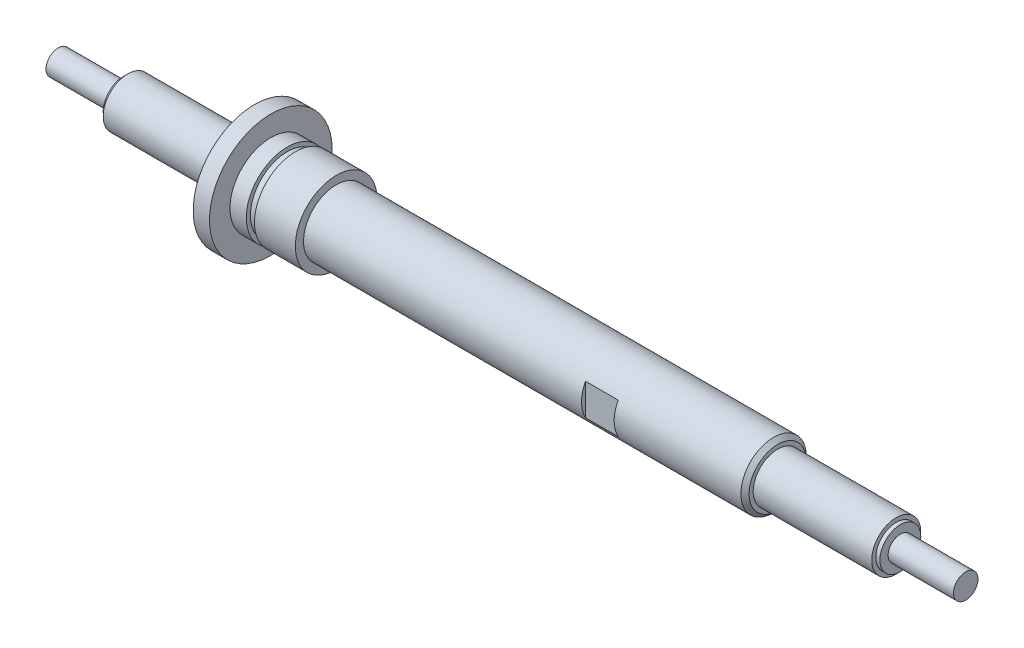
ISO-10303-21;
HEADER;
FILE_DESCRIPTION(('STEP AP214'),'2;1');
FILE_NAME('part.step','',(''),(''),'','','');
FILE_SCHEMA(('AUTOMOTIVE_DESIGN { 1 0 10303 214 1 1 1 1 }'));
ENDSEC;
DATA;
#1=APPLICATION_CONTEXT('core data for automotive mechanical design processes');
#2=APPLICATION_PROTOCOL_DEFINITION('international standard','automotive_design',2000,#1);
#3=PRODUCT_CONTEXT('',#1,'mechanical');
#4=PRODUCT('Part','Part','',(#3));
#5=PRODUCT_RELATED_PRODUCT_CATEGORY('part','',(#4));
#6=PRODUCT_DEFINITION_FORMATION('','',#4);
#7=PRODUCT_DEFINITION_CONTEXT('part definition',#1,'design');
#8=PRODUCT_DEFINITION('design','',#6,#7);
#9=PRODUCT_DEFINITION_SHAPE('','',#8);
#10=(LENGTH_UNIT() NAMED_UNIT(*) SI_UNIT(.MILLI.,.METRE.));
#11=(NAMED_UNIT(*) PLANE_ANGLE_UNIT() SI_UNIT($,.RADIAN.));
#12=(NAMED_UNIT(*) SI_UNIT($,.STERADIAN.) SOLID_ANGLE_UNIT());
#13=UNCERTAINTY_MEASURE_WITH_UNIT(LENGTH_MEASURE(1.E-05),#10,'distance_accuracy_value','');
#14=(GEOMETRIC_REPRESENTATION_CONTEXT(3) GLOBAL_UNCERTAINTY_ASSIGNED_CONTEXT((#13)) GLOBAL_UNIT_ASSIGNED_CONTEXT((#10,
#11,#12)) REPRESENTATION_CONTEXT('',''));
#15=CARTESIAN_POINT('',(0.,0.,0.));
#16=DIRECTION('',(0.,0.,1.));
#17=DIRECTION('',(1.,0.,0.));
#18=AXIS2_PLACEMENT_3D('',#15,#16,#17);
#19=CARTESIAN_POINT('',(-6.,0.,0.));
#20=DIRECTION('',(1.,0.,0.));
#21=DIRECTION('',(0.,0.,-1.));
#22=AXIS2_PLACEMENT_3D('',#19,#20,#21);
#23=CYLINDRICAL_SURFACE('',#22,3.);
#24=CARTESIAN_POINT('',(0.,0.,0.));
#25=DIRECTION('',(1.,0.,0.));
#26=DIRECTION('',(0.,0.,-1.));
#27=AXIS2_PLACEMENT_3D('',#24,#25,#26);
#28=CIRCLE('',#27,3.);
#29=CARTESIAN_POINT('',(0.,0.,-3.));
#30=VERTEX_POINT('',#29);
#31=EDGE_CURVE('E184',#30,#30,#28,.F.);
#32=ORIENTED_EDGE('',*,*,#31,.T.);
#33=EDGE_LOOP('',(#32));
#34=FACE_BOUND('',#33,.T.);
#35=CARTESIAN_POINT('',(-14.5,0.,0.));
#36=DIRECTION('',(1.,0.,0.));
#37=DIRECTION('',(0.,0.,-1.));
#38=AXIS2_PLACEMENT_3D('',#35,#36,#37);
#39=CIRCLE('',#38,3.);
#40=CARTESIAN_POINT('',(-14.5,0.,-3.));
#41=VERTEX_POINT('',#40);
#42=EDGE_CURVE('E243',#41,#41,#39,.T.);
#43=ORIENTED_EDGE('',*,*,#42,.T.);
#44=EDGE_LOOP('',(#43));
#45=FACE_BOUND('',#44,.T.);
#46=ADVANCED_FACE('F103',(#34,#45),#23,.T.);
#47=CARTESIAN_POINT('',(71.,0.,0.));
#48=DIRECTION('',(-1.,0.,0.));
#49=DIRECTION('',(0.,0.,1.));
#50=AXIS2_PLACEMENT_3D('',#47,#48,#49);
#51=CYLINDRICAL_SURFACE('',#50,3.);
#52=CARTESIAN_POINT('',(65.,0.,0.));
#53=DIRECTION('',(1.,0.,0.));
#54=DIRECTION('',(0.,0.,-1.));
#55=AXIS2_PLACEMENT_3D('',#52,#53,#54);
#56=CIRCLE('',#55,3.);
#57=CARTESIAN_POINT('',(65.,0.,-3.));
#58=VERTEX_POINT('',#57);
#59=EDGE_CURVE('E205',#58,#58,#56,.T.);
#60=ORIENTED_EDGE('',*,*,#59,.T.);
#61=EDGE_LOOP('',(#60));
#62=FACE_BOUND('',#61,.T.);
#63=CARTESIAN_POINT('',(79.5,0.,0.));
#64=DIRECTION('',(1.,0.,0.));
#65=DIRECTION('',(0.,0.,-1.));
#66=AXIS2_PLACEMENT_3D('',#63,#64,#65);
#67=CIRCLE('',#66,3.);
#68=CARTESIAN_POINT('',(79.5,0.,-3.));
#69=VERTEX_POINT('',#68);
#70=EDGE_CURVE('E228',#69,#69,#67,.T.);
#71=ORIENTED_EDGE('',*,*,#70,.F.);
#72=EDGE_LOOP('',(#71));
#73=FACE_BOUND('',#72,.T.);
#74=ADVANCED_FACE('F283',(#62,#73),#51,.T.);
#75=CARTESIAN_POINT('',(11.,0.,0.));
#76=DIRECTION('',(-1.,0.,0.));
#77=DIRECTION('',(0.,0.,1.));
#78=AXIS2_PLACEMENT_3D('',#75,#76,#77);
#79=CYLINDRICAL_SURFACE('',#78,5.);
#80=CARTESIAN_POINT('',(3.,0.,0.));
#81=DIRECTION('',(1.,0.,0.));
#82=DIRECTION('',(0.,0.,-1.));
#83=AXIS2_PLACEMENT_3D('',#80,#81,#82);
#84=CIRCLE('',#83,5.);
#85=CARTESIAN_POINT('',(3.,0.,-5.));
#86=VERTEX_POINT('',#85);
#87=EDGE_CURVE('E197',#86,#86,#84,.T.);
#88=ORIENTED_EDGE('',*,*,#87,.T.);
#89=EDGE_LOOP('',(#88));
#90=FACE_BOUND('',#89,.T.);
#91=CARTESIAN_POINT('',(5.,0.,0.));
#92=DIRECTION('',(1.,0.,0.));
#93=DIRECTION('',(0.,0.,-1.));
#94=AXIS2_PLACEMENT_3D('',#91,#92,#93);
#95=CIRCLE('',#94,5.);
#96=CARTESIAN_POINT('',(5.,0.,-5.));
#97=VERTEX_POINT('',#96);
#98=EDGE_CURVE('E209',#97,#97,#95,.T.);
#99=ORIENTED_EDGE('',*,*,#98,.F.);
#100=EDGE_LOOP('',(#99));
#101=FACE_BOUND('',#100,.T.);
#102=ADVANCED_FACE('F288',(#90,#101),#79,.T.);
#103=CARTESIAN_POINT('',(3.,0.,0.));
#104=DIRECTION('',(1.,0.,0.));
#105=DIRECTION('',(0.,0.,-1.));
#106=AXIS2_PLACEMENT_3D('',#103,#104,#105);
#107=PLANE('',#106);
#108=CARTESIAN_POINT('',(3.,0.,0.));
#109=DIRECTION('',(1.,0.,0.));
#110=DIRECTION('',(0.,0.,-1.));
#111=AXIS2_PLACEMENT_3D('',#108,#109,#110);
#112=CIRCLE('',#111,7.5);
#113=CARTESIAN_POINT('',(3.,0.,-7.5));
#114=VERTEX_POINT('',#113);
#115=EDGE_CURVE('E190',#114,#114,#112,.T.);
#116=ORIENTED_EDGE('',*,*,#115,.T.);
#117=EDGE_LOOP('',(#116));
#118=FACE_BOUND('',#117,.T.);
#119=ORIENTED_EDGE('',*,*,#87,.F.);
#120=EDGE_LOOP('',(#119));
#121=FACE_BOUND('',#120,.T.);
#122=ADVANCED_FACE('F297',(#118,#121),#107,.T.);
#123=CARTESIAN_POINT('',(0.,0.,0.));
#124=DIRECTION('',(1.,0.,0.));
#125=DIRECTION('',(0.,0.,-1.));
#126=AXIS2_PLACEMENT_3D('',#123,#124,#125);
#127=PLANE('',#126);
#128=CARTESIAN_POINT('',(0.,0.,0.));
#129=DIRECTION('',(1.,0.,0.));
#130=DIRECTION('',(0.,0.,-1.));
#131=AXIS2_PLACEMENT_3D('',#128,#129,#130);
#132=CIRCLE('',#131,3.5);
#133=CARTESIAN_POINT('',(0.,0.,-3.5));
#134=VERTEX_POINT('',#133);
#135=EDGE_CURVE('E172',#134,#134,#132,.F.);
#136=ORIENTED_EDGE('',*,*,#135,.T.);
#137=EDGE_LOOP('',(#136));
#138=FACE_BOUND('',#137,.T.);
#139=ORIENTED_EDGE('',*,*,#31,.F.);
#140=EDGE_LOOP('',(#139));
#141=FACE_BOUND('',#140,.T.);
#142=ADVANCED_FACE('F293',(#138,#141),#127,.F.);
#143=CARTESIAN_POINT('',(1.,0.,0.));
#144=DIRECTION('',(-1.,0.,0.));
#145=DIRECTION('',(0.,0.,1.));
#146=AXIS2_PLACEMENT_3D('',#143,#144,#145);
#147=CYLINDRICAL_SURFACE('',#146,4.);
#148=CARTESIAN_POINT('',(0.499999999999997,0.,0.));
#149=DIRECTION('',(1.,0.,0.));
#150=DIRECTION('',(0.,0.,-1.));
#151=AXIS2_PLACEMENT_3D('',#148,#149,#150);
#152=CIRCLE('',#151,4.);
#153=CARTESIAN_POINT('',(0.499999999999997,0.,-4.));
#154=VERTEX_POINT('',#153);
#155=EDGE_CURVE('E175',#154,#154,#152,.T.);
#156=ORIENTED_EDGE('',*,*,#155,.T.);
#157=EDGE_LOOP('',(#156));
#158=FACE_BOUND('',#157,.T.);
#159=CARTESIAN_POINT('',(1.,0.,0.));
#160=DIRECTION('',(1.,0.,0.));
#161=DIRECTION('',(0.,0.,-1.));
#162=AXIS2_PLACEMENT_3D('',#159,#160,#161);
#163=CIRCLE('',#162,4.);
#164=CARTESIAN_POINT('',(1.,0.,-4.));
#165=VERTEX_POINT('',#164);
#166=EDGE_CURVE('E187',#165,#165,#163,.T.);
#167=ORIENTED_EDGE('',*,*,#166,.F.);
#168=EDGE_LOOP('',(#167));
#169=FACE_BOUND('',#168,.T.);
#170=ADVANCED_FACE('F296',(#158,#169),#147,.T.);
#171=CARTESIAN_POINT('',(1.,0.,0.));
#172=DIRECTION('',(1.,0.,0.));
#173=DIRECTION('',(0.,0.,-1.));
#174=AXIS2_PLACEMENT_3D('',#171,#172,#173);
#175=PLANE('',#174);
#176=CARTESIAN_POINT('',(1.,0.,0.));
#177=DIRECTION('',(1.,0.,0.));
#178=DIRECTION('',(0.,0.,-1.));
#179=AXIS2_PLACEMENT_3D('',#176,#177,#178);
#180=CIRCLE('',#179,7.5);
#181=CARTESIAN_POINT('',(1.,0.,-7.5));
#182=VERTEX_POINT('',#181);
#183=EDGE_CURVE('E191',#182,#182,#180,.T.);
#184=ORIENTED_EDGE('',*,*,#183,.F.);
#185=EDGE_LOOP('',(#184));
#186=FACE_BOUND('',#185,.T.);
#187=ORIENTED_EDGE('',*,*,#166,.T.);
#188=EDGE_LOOP('',(#187));
#189=FACE_BOUND('',#188,.T.);
#190=ADVANCED_FACE('F300',(#186,#189),#175,.F.);
#191=CARTESIAN_POINT('',(3.,0.,0.));
#192=DIRECTION('',(-1.,0.,0.));
#193=DIRECTION('',(0.,0.,1.));
#194=AXIS2_PLACEMENT_3D('',#191,#192,#193);
#195=CYLINDRICAL_SURFACE('',#194,7.5);
#196=ORIENTED_EDGE('',*,*,#115,.F.);
#197=EDGE_LOOP('',(#196));
#198=FACE_BOUND('',#197,.T.);
#199=ORIENTED_EDGE('',*,*,#183,.T.);
#200=EDGE_LOOP('',(#199));
#201=FACE_BOUND('',#200,.T.);
#202=ADVANCED_FACE('F388',(#198,#201),#195,.T.);
#203=CARTESIAN_POINT('',(0.499999999999997,0.,0.));
#204=DIRECTION('',(1.,0.,0.));
#205=DIRECTION('',(0.,0.,-1.));
#206=AXIS2_PLACEMENT_3D('',#203,#204,#205);
#207=CONICAL_SURFACE('',#206,4.,0.785398163397448);
#208=ORIENTED_EDGE('',*,*,#135,.F.);
#209=EDGE_LOOP('',(#208));
#210=FACE_BOUND('',#209,.T.);
#211=ORIENTED_EDGE('',*,*,#155,.F.);
#212=EDGE_LOOP('',(#211));
#213=FACE_BOUND('',#212,.T.);
#214=ADVANCED_FACE('F105',(#210,#213),#207,.T.);
#215=CARTESIAN_POINT('',(6.,0.,0.));
#216=DIRECTION('',(1.,0.,0.));
#217=DIRECTION('',(0.,0.,-1.));
#218=AXIS2_PLACEMENT_3D('',#215,#216,#217);
#219=PLANE('',#218);
#220=CARTESIAN_POINT('',(6.,0.,0.));
#221=DIRECTION('',(1.,0.,0.));
#222=DIRECTION('',(0.,0.,-1.));
#223=AXIS2_PLACEMENT_3D('',#220,#221,#222);
#224=CIRCLE('',#223,5.);
#225=CARTESIAN_POINT('',(6.,0.,-5.));
#226=VERTEX_POINT('',#225);
#227=EDGE_CURVE('E208',#226,#226,#224,.T.);
#228=ORIENTED_EDGE('',*,*,#227,.F.);
#229=EDGE_LOOP('',(#228));
#230=FACE_BOUND('',#229,.T.);
#231=CARTESIAN_POINT('',(6.,0.,0.));
#232=DIRECTION('',(1.,0.,0.));
#233=DIRECTION('',(0.,0.,-1.));
#234=AXIS2_PLACEMENT_3D('',#231,#232,#233);
#235=CIRCLE('',#234,4.5);
#236=CARTESIAN_POINT('',(6.,0.,-4.5));
#237=VERTEX_POINT('',#236);
#238=EDGE_CURVE('E212',#237,#237,#235,.T.);
#239=ORIENTED_EDGE('',*,*,#238,.T.);
#240=EDGE_LOOP('',(#239));
#241=FACE_BOUND('',#240,.T.);
#242=ADVANCED_FACE('F368',(#230,#241),#219,.F.);
#243=CARTESIAN_POINT('',(5.,0.,0.));
#244=DIRECTION('',(1.,0.,0.));
#245=DIRECTION('',(0.,0.,-1.));
#246=AXIS2_PLACEMENT_3D('',#243,#244,#245);
#247=PLANE('',#246);
#248=ORIENTED_EDGE('',*,*,#98,.T.);
#249=EDGE_LOOP('',(#248));
#250=FACE_BOUND('',#249,.T.);
#251=CARTESIAN_POINT('',(5.,0.,0.));
#252=DIRECTION('',(1.,0.,0.));
#253=DIRECTION('',(0.,0.,-1.));
#254=AXIS2_PLACEMENT_3D('',#251,#252,#253);
#255=CIRCLE('',#254,4.5);
#256=CARTESIAN_POINT('',(5.,0.,-4.5));
#257=VERTEX_POINT('',#256);
#258=EDGE_CURVE('E215',#257,#257,#255,.T.);
#259=ORIENTED_EDGE('',*,*,#258,.F.);
#260=EDGE_LOOP('',(#259));
#261=FACE_BOUND('',#260,.T.);
#262=ADVANCED_FACE('F366',(#250,#261),#247,.T.);
#263=CARTESIAN_POINT('',(6.,0.,0.));
#264=DIRECTION('',(-1.,0.,0.));
#265=DIRECTION('',(0.,0.,1.));
#266=AXIS2_PLACEMENT_3D('',#263,#264,#265);
#267=CYLINDRICAL_SURFACE('',#266,4.5);
#268=ORIENTED_EDGE('',*,*,#238,.F.);
#269=EDGE_LOOP('',(#268));
#270=FACE_BOUND('',#269,.T.);
#271=ORIENTED_EDGE('',*,*,#258,.T.);
#272=EDGE_LOOP('',(#271));
#273=FACE_BOUND('',#272,.T.);
#274=ADVANCED_FACE('F312',(#270,#273),#267,.T.);
#275=CARTESIAN_POINT('',(65.,0.,0.));
#276=DIRECTION('',(1.,0.,0.));
#277=DIRECTION('',(0.,0.,-1.));
#278=AXIS2_PLACEMENT_3D('',#275,#276,#277);
#279=PLANE('',#278);
#280=CARTESIAN_POINT('',(65.,0.,0.));
#281=DIRECTION('',(1.,0.,0.));
#282=DIRECTION('',(0.,0.,-1.));
#283=AXIS2_PLACEMENT_3D('',#280,#281,#282);
#284=CIRCLE('',#283,3.49999999999999);
#285=CARTESIAN_POINT('',(65.,0.,-3.49999999999999));
#286=VERTEX_POINT('',#285);
#287=EDGE_CURVE('E181',#286,#286,#284,.T.);
#288=ORIENTED_EDGE('',*,*,#287,.T.);
#289=EDGE_LOOP('',(#288));
#290=FACE_BOUND('',#289,.T.);
#291=ORIENTED_EDGE('',*,*,#59,.F.);
#292=EDGE_LOOP('',(#291));
#293=FACE_BOUND('',#292,.T.);
#294=ADVANCED_FACE('F304',(#290,#293),#279,.T.);
#295=CARTESIAN_POINT('',(65.,0.,0.));
#296=DIRECTION('',(-1.,0.,0.));
#297=DIRECTION('',(0.,0.,1.));
#298=AXIS2_PLACEMENT_3D('',#295,#296,#297);
#299=CONICAL_SURFACE('',#298,3.49999999999999,0.785398163397445);
#300=CARTESIAN_POINT('',(64.5,0.,0.));
#301=DIRECTION('',(1.,0.,0.));
#302=DIRECTION('',(0.,0.,-1.));
#303=AXIS2_PLACEMENT_3D('',#300,#301,#302);
#304=CIRCLE('',#303,4.);
#305=CARTESIAN_POINT('',(64.5,0.,-4.));
#306=VERTEX_POINT('',#305);
#307=EDGE_CURVE('E178',#306,#306,#304,.F.);
#308=ORIENTED_EDGE('',*,*,#307,.F.);
#309=EDGE_LOOP('',(#308));
#310=FACE_BOUND('',#309,.T.);
#311=ORIENTED_EDGE('',*,*,#287,.F.);
#312=EDGE_LOOP('',(#311));
#313=FACE_BOUND('',#312,.T.);
#314=ADVANCED_FACE('F302',(#310,#313),#299,.T.);
#315=CARTESIAN_POINT('',(65.,0.,0.));
#316=DIRECTION('',(-1.,0.,0.));
#317=DIRECTION('',(0.,0.,1.));
#318=AXIS2_PLACEMENT_3D('',#315,#316,#317);
#319=CYLINDRICAL_SURFACE('',#318,4.);
#320=CARTESIAN_POINT('',(45.,0.,0.));
#321=DIRECTION('',(-1.,0.,0.));
#322=DIRECTION('',(0.,0.,1.));
#323=AXIS2_PLACEMENT_3D('',#320,#321,#322);
#324=CIRCLE('',#323,4.);
#325=CARTESIAN_POINT('',(45.,-1.93649167310371,3.5));
#326=VERTEX_POINT('',#325);
#327=CARTESIAN_POINT('',(45.,1.93649167310371,3.5));
#328=VERTEX_POINT('',#327);
#329=EDGE_CURVE('E14',#326,#328,#324,.T.);
#330=ORIENTED_EDGE('',*,*,#329,.T.);
#331=DIRECTION('',(-1.,0.,0.));
#332=VECTOR('',#331,1.);
#333=CARTESIAN_POINT('',(65.,1.93649167310371,3.5));
#334=LINE('',#333,#332);
#335=CARTESIAN_POINT('',(49.,1.9364916731037,3.5));
#336=VERTEX_POINT('',#335);
#337=EDGE_CURVE('E147',#328,#336,#334,.F.);
#338=ORIENTED_EDGE('',*,*,#337,.T.);
#339=CARTESIAN_POINT('',(49.,0.,0.));
#340=DIRECTION('',(1.,0.,0.));
#341=DIRECTION('',(0.,0.,-1.));
#342=AXIS2_PLACEMENT_3D('',#339,#340,#341);
#343=CIRCLE('',#342,4.);
#344=CARTESIAN_POINT('',(49.,-1.9364916731037,3.5));
#345=VERTEX_POINT('',#344);
#346=EDGE_CURVE('E142',#336,#345,#343,.T.);
#347=ORIENTED_EDGE('',*,*,#346,.T.);
#348=DIRECTION('',(-1.,0.,0.));
#349=VECTOR('',#348,1.);
#350=CARTESIAN_POINT('',(65.,-1.93649167310371,3.5));
#351=LINE('',#350,#349);
#352=EDGE_CURVE('E111',#345,#326,#351,.T.);
#353=ORIENTED_EDGE('',*,*,#352,.T.);
#354=EDGE_LOOP('',(#330,#338,#347,#353));
#355=FACE_BOUND('',#354,.T.);
#356=CARTESIAN_POINT('',(49.,0.,0.));
#357=DIRECTION('',(1.,0.,0.));
#358=DIRECTION('',(0.,0.,-1.));
#359=AXIS2_PLACEMENT_3D('',#356,#357,#358);
#360=CIRCLE('',#359,4.);
#361=CARTESIAN_POINT('',(49.,-1.93649167310371,-3.5));
#362=VERTEX_POINT('',#361);
#363=CARTESIAN_POINT('',(49.,1.93649167310371,-3.5));
#364=VERTEX_POINT('',#363);
#365=EDGE_CURVE('E167',#362,#364,#360,.T.);
#366=ORIENTED_EDGE('',*,*,#365,.T.);
#367=DIRECTION('',(-1.,0.,0.));
#368=VECTOR('',#367,1.);
#369=CARTESIAN_POINT('',(65.,1.93649167310371,-3.5));
#370=LINE('',#369,#368);
#371=CARTESIAN_POINT('',(45.,1.93649167310371,-3.5));
#372=VERTEX_POINT('',#371);
#373=EDGE_CURVE('E148',#364,#372,#370,.T.);
#374=ORIENTED_EDGE('',*,*,#373,.T.);
#375=CARTESIAN_POINT('',(45.,0.,0.));
#376=DIRECTION('',(-1.,0.,0.));
#377=DIRECTION('',(0.,0.,1.));
#378=AXIS2_PLACEMENT_3D('',#375,#376,#377);
#379=CIRCLE('',#378,4.);
#380=CARTESIAN_POINT('',(45.,-1.93649167310371,-3.5));
#381=VERTEX_POINT('',#380);
#382=EDGE_CURVE('E164',#372,#381,#379,.T.);
#383=ORIENTED_EDGE('',*,*,#382,.T.);
#384=DIRECTION('',(-1.,0.,0.));
#385=VECTOR('',#384,1.);
#386=CARTESIAN_POINT('',(65.,-1.93649167310371,-3.5));
#387=LINE('',#386,#385);
#388=EDGE_CURVE('E169',#381,#362,#387,.F.);
#389=ORIENTED_EDGE('',*,*,#388,.T.);
#390=EDGE_LOOP('',(#366,#374,#383,#389));
#391=FACE_BOUND('',#390,.T.);
#392=ORIENTED_EDGE('',*,*,#307,.T.);
#393=EDGE_LOOP('',(#392));
#394=FACE_BOUND('',#393,.T.);
#395=CARTESIAN_POINT('',(11.,0.,0.));
#396=DIRECTION('',(1.,0.,0.));
#397=DIRECTION('',(0.,0.,-1.));
#398=AXIS2_PLACEMENT_3D('',#395,#396,#397);
#399=CIRCLE('',#398,4.);
#400=CARTESIAN_POINT('',(11.,0.,-4.));
#401=VERTEX_POINT('',#400);
#402=EDGE_CURVE('E200',#401,#401,#399,.T.);
#403=ORIENTED_EDGE('',*,*,#402,.T.);
#404=EDGE_LOOP('',(#403));
#405=FACE_BOUND('',#404,.T.);
#406=ADVANCED_FACE('F158',(#355,#391,#394,#405),#319,.T.);
#407=CARTESIAN_POINT('',(11.,0.,0.));
#408=DIRECTION('',(1.,0.,0.));
#409=DIRECTION('',(0.,0.,-1.));
#410=AXIS2_PLACEMENT_3D('',#407,#408,#409);
#411=PLANE('',#410);
#412=CARTESIAN_POINT('',(11.,0.,0.));
#413=DIRECTION('',(1.,0.,0.));
#414=DIRECTION('',(0.,0.,-1.));
#415=AXIS2_PLACEMENT_3D('',#412,#413,#414);
#416=CIRCLE('',#415,5.);
#417=CARTESIAN_POINT('',(11.,0.,-5.));
#418=VERTEX_POINT('',#417);
#419=EDGE_CURVE('E194',#418,#418,#416,.T.);
#420=ORIENTED_EDGE('',*,*,#419,.T.);
#421=EDGE_LOOP('',(#420));
#422=FACE_BOUND('',#421,.T.);
#423=ORIENTED_EDGE('',*,*,#402,.F.);
#424=EDGE_LOOP('',(#423));
#425=FACE_BOUND('',#424,.T.);
#426=ADVANCED_FACE('F310',(#422,#425),#411,.T.);
#427=ORIENTED_EDGE('',*,*,#227,.T.);
#428=EDGE_LOOP('',(#427));
#429=FACE_BOUND('',#428,.T.);
#430=ORIENTED_EDGE('',*,*,#419,.F.);
#431=EDGE_LOOP('',(#430));
#432=FACE_BOUND('',#431,.T.);
#433=ADVANCED_FACE('F362',(#429,#432),#79,.T.);
#434=CARTESIAN_POINT('',(45.,-5.,-4.));
#435=DIRECTION('',(-1.,0.,0.));
#436=DIRECTION('',(0.,0.,1.));
#437=AXIS2_PLACEMENT_3D('',#434,#435,#436);
#438=PLANE('',#437);
#439=DIRECTION('',(0.,1.,0.));
#440=VECTOR('',#439,1.);
#441=CARTESIAN_POINT('',(45.,-5.,-3.5));
#442=LINE('',#441,#440);
#443=EDGE_CURVE('E220',#381,#372,#442,.T.);
#444=ORIENTED_EDGE('',*,*,#443,.F.);
#445=ORIENTED_EDGE('',*,*,#382,.F.);
#446=EDGE_LOOP('',(#444,#445));
#447=FACE_BOUND('',#446,.T.);
#448=ADVANCED_FACE('F356',(#447),#438,.F.);
#449=CARTESIAN_POINT('',(49.,-5.,-4.));
#450=DIRECTION('',(1.,0.,0.));
#451=DIRECTION('',(0.,0.,-1.));
#452=AXIS2_PLACEMENT_3D('',#449,#450,#451);
#453=PLANE('',#452);
#454=ORIENTED_EDGE('',*,*,#365,.F.);
#455=DIRECTION('',(0.,1.,0.));
#456=VECTOR('',#455,1.);
#457=CARTESIAN_POINT('',(49.,-5.,-3.5));
#458=LINE('',#457,#456);
#459=EDGE_CURVE('E125',#362,#364,#458,.T.);
#460=ORIENTED_EDGE('',*,*,#459,.T.);
#461=EDGE_LOOP('',(#454,#460));
#462=FACE_BOUND('',#461,.T.);
#463=ADVANCED_FACE('F353',(#462),#453,.F.);
#464=CARTESIAN_POINT('',(45.,-5.,-3.5));
#465=DIRECTION('',(0.,0.,1.));
#466=DIRECTION('',(1.,0.,0.));
#467=AXIS2_PLACEMENT_3D('',#464,#465,#466);
#468=PLANE('',#467);
#469=ORIENTED_EDGE('',*,*,#459,.F.);
#470=ORIENTED_EDGE('',*,*,#388,.F.);
#471=ORIENTED_EDGE('',*,*,#443,.T.);
#472=ORIENTED_EDGE('',*,*,#373,.F.);
#473=EDGE_LOOP('',(#469,#470,#471,#472));
#474=FACE_BOUND('',#473,.T.);
#475=ADVANCED_FACE('F349',(#474),#468,.F.);
#476=CARTESIAN_POINT('',(45.,-5.,4.));
#477=DIRECTION('',(-1.,0.,0.));
#478=DIRECTION('',(0.,0.,1.));
#479=AXIS2_PLACEMENT_3D('',#476,#477,#478);
#480=PLANE('',#479);
#481=ORIENTED_EDGE('',*,*,#329,.F.);
#482=DIRECTION('',(0.,1.,0.));
#483=VECTOR('',#482,1.);
#484=CARTESIAN_POINT('',(45.,-5.,3.5));
#485=LINE('',#484,#483);
#486=EDGE_CURVE('E155',#326,#328,#485,.T.);
#487=ORIENTED_EDGE('',*,*,#486,.T.);
#488=EDGE_LOOP('',(#481,#487));
#489=FACE_BOUND('',#488,.T.);
#490=ADVANCED_FACE('F346',(#489),#480,.F.);
#491=CARTESIAN_POINT('',(45.,-5.,3.5));
#492=DIRECTION('',(0.,0.,-1.));
#493=DIRECTION('',(-1.,0.,0.));
#494=AXIS2_PLACEMENT_3D('',#491,#492,#493);
#495=PLANE('',#494);
#496=DIRECTION('',(0.,1.,0.));
#497=VECTOR('',#496,1.);
#498=CARTESIAN_POINT('',(49.,-5.,3.5));
#499=LINE('',#498,#497);
#500=EDGE_CURVE('E117',#345,#336,#499,.T.);
#501=ORIENTED_EDGE('',*,*,#500,.T.);
#502=ORIENTED_EDGE('',*,*,#337,.F.);
#503=ORIENTED_EDGE('',*,*,#486,.F.);
#504=ORIENTED_EDGE('',*,*,#352,.F.);
#505=EDGE_LOOP('',(#501,#502,#503,#504));
#506=FACE_BOUND('',#505,.T.);
#507=ADVANCED_FACE('F152',(#506),#495,.F.);
#508=CARTESIAN_POINT('',(49.,-5.,4.));
#509=DIRECTION('',(1.,0.,0.));
#510=DIRECTION('',(0.,0.,-1.));
#511=AXIS2_PLACEMENT_3D('',#508,#509,#510);
#512=PLANE('',#511);
#513=ORIENTED_EDGE('',*,*,#500,.F.);
#514=ORIENTED_EDGE('',*,*,#346,.F.);
#515=EDGE_LOOP('',(#513,#514));
#516=FACE_BOUND('',#515,.T.);
#517=ADVANCED_FACE('F143',(#516),#512,.F.);
#518=CARTESIAN_POINT('',(79.5,0.,0.));
#519=DIRECTION('',(1.,0.,0.));
#520=DIRECTION('',(0.,0.,-1.));
#521=AXIS2_PLACEMENT_3D('',#518,#519,#520);
#522=PLANE('',#521);
#523=CARTESIAN_POINT('',(79.5,0.,0.));
#524=DIRECTION('',(1.,0.,0.));
#525=DIRECTION('',(0.,0.,-1.));
#526=AXIS2_PLACEMENT_3D('',#523,#524,#525);
#527=CIRCLE('',#526,2.5);
#528=CARTESIAN_POINT('',(79.5,0.,-2.5));
#529=VERTEX_POINT('',#528);
#530=EDGE_CURVE('E233',#529,#529,#527,.T.);
#531=ORIENTED_EDGE('',*,*,#530,.F.);
#532=EDGE_LOOP('',(#531));
#533=FACE_BOUND('',#532,.T.);
#534=ORIENTED_EDGE('',*,*,#70,.T.);
#535=EDGE_LOOP('',(#534));
#536=FACE_BOUND('',#535,.T.);
#537=ADVANCED_FACE('F323',(#533,#536),#522,.T.);
#538=CARTESIAN_POINT('',(79.5,0.,0.));
#539=DIRECTION('',(1.,0.,0.));
#540=DIRECTION('',(0.,0.,-1.));
#541=AXIS2_PLACEMENT_3D('',#538,#539,#540);
#542=CYLINDRICAL_SURFACE('',#541,2.5);
#543=ORIENTED_EDGE('',*,*,#530,.T.);
#544=EDGE_LOOP('',(#543));
#545=FACE_BOUND('',#544,.T.);
#546=CARTESIAN_POINT('',(80.,0.,0.));
#547=DIRECTION('',(1.,0.,0.));
#548=DIRECTION('',(0.,0.,-1.));
#549=AXIS2_PLACEMENT_3D('',#546,#547,#548);
#550=CIRCLE('',#549,2.5);
#551=CARTESIAN_POINT('',(80.,0.,-2.5));
#552=VERTEX_POINT('',#551);
#553=EDGE_CURVE('E234',#552,#552,#550,.T.);
#554=ORIENTED_EDGE('',*,*,#553,.F.);
#555=EDGE_LOOP('',(#554));
#556=FACE_BOUND('',#555,.T.);
#557=ADVANCED_FACE('F325',(#545,#556),#542,.T.);
#558=CARTESIAN_POINT('',(88.,0.,0.));
#559=DIRECTION('',(1.,0.,0.));
#560=DIRECTION('',(0.,0.,-1.));
#561=AXIS2_PLACEMENT_3D('',#558,#559,#560);
#562=PLANE('',#561);
#563=CARTESIAN_POINT('',(88.,0.,0.));
#564=DIRECTION('',(1.,0.,0.));
#565=DIRECTION('',(0.,0.,-1.));
#566=AXIS2_PLACEMENT_3D('',#563,#564,#565);
#567=CIRCLE('',#566,1.5);
#568=CARTESIAN_POINT('',(88.,0.,-1.5));
#569=VERTEX_POINT('',#568);
#570=EDGE_CURVE('E225',#569,#569,#567,.T.);
#571=ORIENTED_EDGE('',*,*,#570,.T.);
#572=EDGE_LOOP('',(#571));
#573=FACE_BOUND('',#572,.T.);
#574=ADVANCED_FACE('F332',(#573),#562,.T.);
#575=CARTESIAN_POINT('',(80.,0.,0.));
#576=DIRECTION('',(1.,0.,0.));
#577=DIRECTION('',(0.,0.,-1.));
#578=AXIS2_PLACEMENT_3D('',#575,#576,#577);
#579=CYLINDRICAL_SURFACE('',#578,1.5);
#580=CARTESIAN_POINT('',(80.,0.,0.));
#581=DIRECTION('',(1.,0.,0.));
#582=DIRECTION('',(0.,0.,-1.));
#583=AXIS2_PLACEMENT_3D('',#580,#581,#582);
#584=CIRCLE('',#583,1.5);
#585=CARTESIAN_POINT('',(80.,0.,-1.5));
#586=VERTEX_POINT('',#585);
#587=EDGE_CURVE('E156',#586,#586,#584,.T.);
#588=ORIENTED_EDGE('',*,*,#587,.T.);
#589=EDGE_LOOP('',(#588));
#590=FACE_BOUND('',#589,.T.);
#591=ORIENTED_EDGE('',*,*,#570,.F.);
#592=EDGE_LOOP('',(#591));
#593=FACE_BOUND('',#592,.T.);
#594=ADVANCED_FACE('F338',(#590,#593),#579,.T.);
#595=CARTESIAN_POINT('',(80.,0.,0.));
#596=DIRECTION('',(1.,0.,0.));
#597=DIRECTION('',(0.,0.,-1.));
#598=AXIS2_PLACEMENT_3D('',#595,#596,#597);
#599=PLANE('',#598);
#600=ORIENTED_EDGE('',*,*,#587,.F.);
#601=EDGE_LOOP('',(#600));
#602=FACE_BOUND('',#601,.T.);
#603=ORIENTED_EDGE('',*,*,#553,.T.);
#604=EDGE_LOOP('',(#603));
#605=FACE_BOUND('',#604,.T.);
#606=ADVANCED_FACE('F341',(#602,#605),#599,.T.);
#607=CARTESIAN_POINT('',(-14.5,0.,0.));
#608=DIRECTION('',(-1.,0.,0.));
#609=DIRECTION('',(0.,0.,-1.));
#610=AXIS2_PLACEMENT_3D('',#607,#608,#609);
#611=PLANE('',#610);
#612=ORIENTED_EDGE('',*,*,#42,.F.);
#613=EDGE_LOOP('',(#612));
#614=FACE_BOUND('',#613,.T.);
#615=CARTESIAN_POINT('',(-14.5,0.,0.));
#616=DIRECTION('',(1.,0.,0.));
#617=DIRECTION('',(0.,0.,-1.));
#618=AXIS2_PLACEMENT_3D('',#615,#616,#617);
#619=CIRCLE('',#618,2.5);
#620=CARTESIAN_POINT('',(-14.5,0.,-2.5));
#621=VERTEX_POINT('',#620);
#622=EDGE_CURVE('E248',#621,#621,#619,.T.);
#623=ORIENTED_EDGE('',*,*,#622,.T.);
#624=EDGE_LOOP('',(#623));
#625=FACE_BOUND('',#624,.T.);
#626=ADVANCED_FACE('F255',(#614,#625),#611,.T.);
#627=CARTESIAN_POINT('',(-14.5,0.,0.));
#628=DIRECTION('',(-1.,0.,0.));
#629=DIRECTION('',(0.,0.,1.));
#630=AXIS2_PLACEMENT_3D('',#627,#628,#629);
#631=CYLINDRICAL_SURFACE('',#630,2.5);
#632=ORIENTED_EDGE('',*,*,#622,.F.);
#633=EDGE_LOOP('',(#632));
#634=FACE_BOUND('',#633,.T.);
#635=CARTESIAN_POINT('',(-15.,0.,0.));
#636=DIRECTION('',(1.,0.,0.));
#637=DIRECTION('',(0.,0.,-1.));
#638=AXIS2_PLACEMENT_3D('',#635,#636,#637);
#639=CIRCLE('',#638,2.5);
#640=CARTESIAN_POINT('',(-15.,0.,-2.5));
#641=VERTEX_POINT('',#640);
#642=EDGE_CURVE('E249',#641,#641,#639,.T.);
#643=ORIENTED_EDGE('',*,*,#642,.T.);
#644=EDGE_LOOP('',(#643));
#645=FACE_BOUND('',#644,.T.);
#646=ADVANCED_FACE('F257',(#634,#645),#631,.T.);
#647=CARTESIAN_POINT('',(-23.,0.,0.));
#648=DIRECTION('',(-1.,0.,0.));
#649=DIRECTION('',(0.,0.,1.));
#650=AXIS2_PLACEMENT_3D('',#647,#648,#649);
#651=PLANE('',#650);
#652=CARTESIAN_POINT('',(-23.,0.,0.));
#653=DIRECTION('',(1.,0.,0.));
#654=DIRECTION('',(0.,0.,-1.));
#655=AXIS2_PLACEMENT_3D('',#652,#653,#654);
#656=CIRCLE('',#655,1.5);
#657=CARTESIAN_POINT('',(-23.,0.,-1.5));
#658=VERTEX_POINT('',#657);
#659=EDGE_CURVE('E240',#658,#658,#656,.T.);
#660=ORIENTED_EDGE('',*,*,#659,.F.);
#661=EDGE_LOOP('',(#660));
#662=FACE_BOUND('',#661,.T.);
#663=ADVANCED_FACE('F260',(#662),#651,.T.);
#664=CARTESIAN_POINT('',(-15.,0.,0.));
#665=DIRECTION('',(-1.,0.,0.));
#666=DIRECTION('',(0.,0.,1.));
#667=AXIS2_PLACEMENT_3D('',#664,#665,#666);
#668=CYLINDRICAL_SURFACE('',#667,1.5);
#669=CARTESIAN_POINT('',(-15.,0.,0.));
#670=DIRECTION('',(1.,0.,0.));
#671=DIRECTION('',(0.,0.,-1.));
#672=AXIS2_PLACEMENT_3D('',#669,#670,#671);
#673=CIRCLE('',#672,1.5);
#674=CARTESIAN_POINT('',(-15.,0.,-1.5));
#675=VERTEX_POINT('',#674);
#676=EDGE_CURVE('E237',#675,#675,#673,.T.);
#677=ORIENTED_EDGE('',*,*,#676,.F.);
#678=EDGE_LOOP('',(#677));
#679=FACE_BOUND('',#678,.T.);
#680=ORIENTED_EDGE('',*,*,#659,.T.);
#681=EDGE_LOOP('',(#680));
#682=FACE_BOUND('',#681,.T.);
#683=ADVANCED_FACE('F267',(#679,#682),#668,.T.);
#684=CARTESIAN_POINT('',(-15.,0.,0.));
#685=DIRECTION('',(-1.,0.,0.));
#686=DIRECTION('',(0.,0.,-1.));
#687=AXIS2_PLACEMENT_3D('',#684,#685,#686);
#688=PLANE('',#687);
#689=ORIENTED_EDGE('',*,*,#642,.F.);
#690=EDGE_LOOP('',(#689));
#691=FACE_BOUND('',#690,.T.);
#692=ORIENTED_EDGE('',*,*,#676,.T.);
#693=EDGE_LOOP('',(#692));
#694=FACE_BOUND('',#693,.T.);
#695=ADVANCED_FACE('F264',(#691,#694),#688,.T.);
#696=CLOSED_SHELL('',(#46,#74,#102,#122,#142,#170,#190,#202,#214,#242,#262,#274,#294,#314,#406,
#426,#433,#448,#463,#475,#490,#507,#517,#537,#557,#574,#594,#606,#626,#646,#663,#683,#695));
#697=MANIFOLD_SOLID_BREP('B2',#696);
#698=ADVANCED_BREP_SHAPE_REPRESENTATION('',(#18,#697),#14);
#699=SHAPE_DEFINITION_REPRESENTATION(#9,#698);
ENDSEC;
END-ISO-10303-21;
